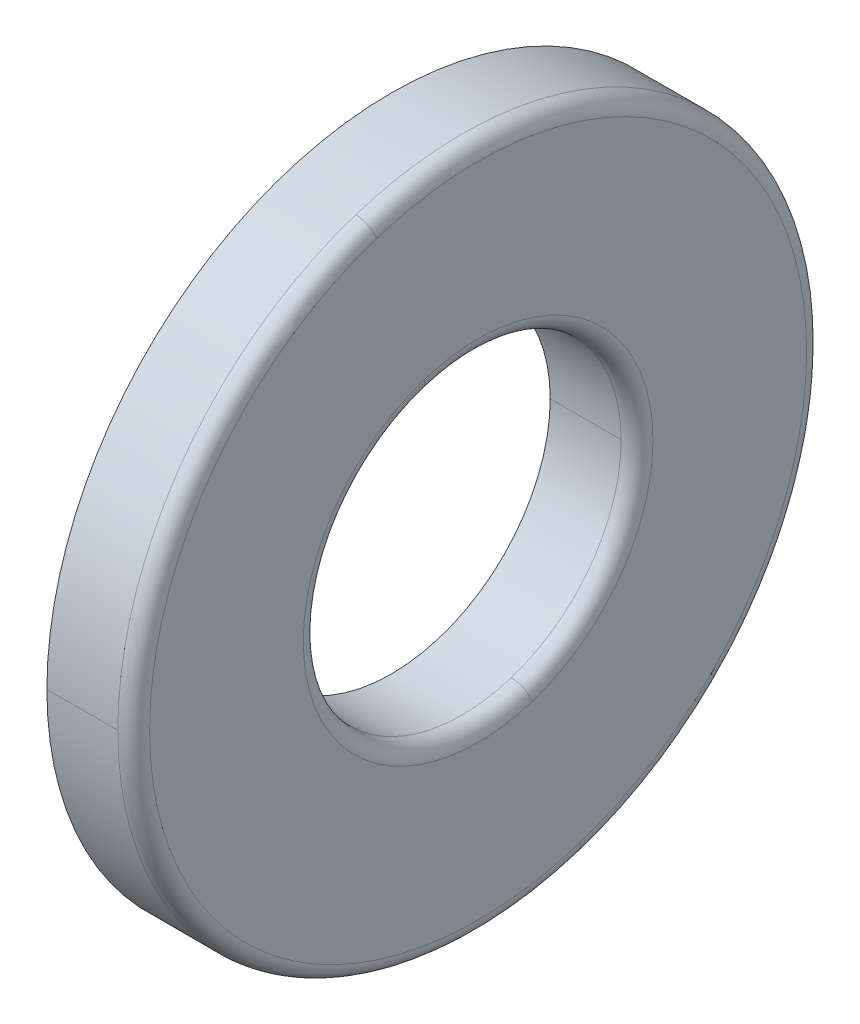
ISO-10303-21;
HEADER;
FILE_DESCRIPTION(('STEP AP214'),'2;1');
FILE_NAME('part.step','',(''),(''),'','','');
FILE_SCHEMA(('AUTOMOTIVE_DESIGN { 1 0 10303 214 1 1 1 1 }'));
ENDSEC;
DATA;
#1=APPLICATION_CONTEXT('core data for automotive mechanical design processes');
#2=APPLICATION_PROTOCOL_DEFINITION('international standard','automotive_design',2000,#1);
#3=PRODUCT_CONTEXT('',#1,'mechanical');
#4=PRODUCT('Part','Part','',(#3));
#5=PRODUCT_RELATED_PRODUCT_CATEGORY('part','',(#4));
#6=PRODUCT_DEFINITION_FORMATION('','',#4);
#7=PRODUCT_DEFINITION_CONTEXT('part definition',#1,'design');
#8=PRODUCT_DEFINITION('design','',#6,#7);
#9=PRODUCT_DEFINITION_SHAPE('','',#8);
#10=(LENGTH_UNIT() NAMED_UNIT(*) SI_UNIT(.MILLI.,.METRE.));
#11=(NAMED_UNIT(*) PLANE_ANGLE_UNIT() SI_UNIT($,.RADIAN.));
#12=(NAMED_UNIT(*) SI_UNIT($,.STERADIAN.) SOLID_ANGLE_UNIT());
#13=UNCERTAINTY_MEASURE_WITH_UNIT(LENGTH_MEASURE(1.E-05),#10,'distance_accuracy_value','');
#14=(GEOMETRIC_REPRESENTATION_CONTEXT(3) GLOBAL_UNCERTAINTY_ASSIGNED_CONTEXT((#13)) GLOBAL_UNIT_ASSIGNED_CONTEXT((#10,
#11,#12)) REPRESENTATION_CONTEXT('',''));
#15=CARTESIAN_POINT('',(0.,0.,0.));
#16=DIRECTION('',(0.,0.,1.));
#17=DIRECTION('',(1.,0.,0.));
#18=AXIS2_PLACEMENT_3D('',#15,#16,#17);
#19=CARTESIAN_POINT('',(5.5,0.,0.));
#20=DIRECTION('',(1.,0.,0.));
#21=DIRECTION('',(0.,-0.309016994374947,0.951056516295154));
#22=AXIS2_PLACEMENT_3D('',#19,#20,#21);
#23=TOROIDAL_SURFACE('',#22,9.,2.778);
#24=CARTESIAN_POINT('',(5.5,-8.55950864665638,-2.78115294937453));
#25=DIRECTION('',(0.,0.309016994374947,-0.951056516295154));
#26=DIRECTION('',(0.8,0.570633909777092,0.185410196624968));
#27=AXIS2_PLACEMENT_3D('',#24,#25,#26);
#28=CIRCLE('',#27,2.778);
#29=CARTESIAN_POINT('',(7.7224,-6.97428764529562,-2.26608342315036));
#30=VERTEX_POINT('',#29);
#31=CARTESIAN_POINT('',(7.7224,-10.1447296480171,-3.29622247559869));
#32=VERTEX_POINT('',#31);
#33=EDGE_CURVE('E11',#30,#32,#28,.T.);
#34=ORIENTED_EDGE('',*,*,#33,.F.);
#35=CARTESIAN_POINT('',(7.7224,0.,0.));
#36=DIRECTION('',(1.,0.,0.));
#37=DIRECTION('',(0.,-0.951056516295154,-0.309016994374947));
#38=AXIS2_PLACEMENT_3D('',#35,#36,#37);
#39=CIRCLE('',#38,7.3332);
#40=CARTESIAN_POINT('',(7.7224,6.97428764529562,2.26608342315036));
#41=VERTEX_POINT('',#40);
#42=EDGE_CURVE('E24',#30,#41,#39,.T.);
#43=ORIENTED_EDGE('',*,*,#42,.T.);
#44=CARTESIAN_POINT('',(5.5,8.55950864665638,2.78115294937453));
#45=DIRECTION('',(0.,-0.309016994374947,0.951056516295154));
#46=DIRECTION('',(0.8,-0.570633909777092,-0.185410196624968));
#47=AXIS2_PLACEMENT_3D('',#44,#45,#46);
#48=CIRCLE('',#47,2.778);
#49=CARTESIAN_POINT('',(7.7224,10.1447296480171,3.29622247559869));
#50=VERTEX_POINT('',#49);
#51=EDGE_CURVE('E326',#41,#50,#48,.T.);
#52=ORIENTED_EDGE('',*,*,#51,.T.);
#53=CARTESIAN_POINT('',(7.7224,0.,0.));
#54=DIRECTION('',(1.,0.,0.));
#55=DIRECTION('',(0.,-0.951056516295154,-0.309016994374947));
#56=AXIS2_PLACEMENT_3D('',#53,#54,#55);
#57=CIRCLE('',#56,10.6668);
#58=EDGE_CURVE('E322',#32,#50,#57,.T.);
#59=ORIENTED_EDGE('',*,*,#58,.F.);
#60=EDGE_LOOP('',(#34,#43,#52,#59));
#61=FACE_BOUND('',#60,.T.);
#62=ADVANCED_FACE('F16',(#61),#23,.F.);
#63=CARTESIAN_POINT('',(7.7224,13.,0.));
#64=DIRECTION('',(-1.,0.,0.));
#65=DIRECTION('',(0.,0.,1.));
#66=AXIS2_PLACEMENT_3D('',#63,#64,#65);
#67=PLANE('',#66);
#68=ORIENTED_EDGE('',*,*,#58,.T.);
#69=CARTESIAN_POINT('',(7.7224,0.,0.));
#70=DIRECTION('',(1.,0.,0.));
#71=DIRECTION('',(0.,0.,-1.));
#72=AXIS2_PLACEMENT_3D('',#69,#70,#71);
#73=CIRCLE('',#72,10.6668);
#74=EDGE_CURVE('E317',#50,#32,#73,.T.);
#75=ORIENTED_EDGE('',*,*,#74,.T.);
#76=EDGE_LOOP('',(#68,#75));
#77=FACE_BOUND('',#76,.T.);
#78=CARTESIAN_POINT('',(7.7224,0.,0.));
#79=DIRECTION('',(1.,0.,0.));
#80=DIRECTION('',(0.,0.,-1.));
#81=AXIS2_PLACEMENT_3D('',#78,#79,#80);
#82=CIRCLE('',#81,13.);
#83=CARTESIAN_POINT('',(7.7224,0.,13.));
#84=VERTEX_POINT('',#83);
#85=CARTESIAN_POINT('',(7.7224,0.,-13.));
#86=VERTEX_POINT('',#85);
#87=EDGE_CURVE('E312',#84,#86,#82,.T.);
#88=ORIENTED_EDGE('',*,*,#87,.F.);
#89=CARTESIAN_POINT('',(7.7224,0.,0.));
#90=DIRECTION('',(1.,0.,0.));
#91=DIRECTION('',(0.,0.,-1.));
#92=AXIS2_PLACEMENT_3D('',#89,#90,#91);
#93=CIRCLE('',#92,13.);
#94=EDGE_CURVE('E307',#86,#84,#93,.T.);
#95=ORIENTED_EDGE('',*,*,#94,.F.);
#96=EDGE_LOOP('',(#88,#95));
#97=FACE_BOUND('',#96,.T.);
#98=ADVANCED_FACE('F232',(#77,#97),#67,.T.);
#99=CARTESIAN_POINT('',(10.4,0.,0.));
#100=DIRECTION('',(1.,0.,0.));
#101=DIRECTION('',(0.,-1.,0.));
#102=AXIS2_PLACEMENT_3D('',#99,#100,#101);
#103=CYLINDRICAL_SURFACE('',#102,13.);
#104=DIRECTION('',(1.,0.,0.));
#105=VECTOR('',#104,1.);
#106=CARTESIAN_POINT('',(7.7224,0.,13.));
#107=LINE('',#106,#105);
#108=CARTESIAN_POINT('',(10.4,0.,13.));
#109=VERTEX_POINT('',#108);
#110=EDGE_CURVE('E303',#84,#109,#107,.T.);
#111=ORIENTED_EDGE('',*,*,#110,.T.);
#112=CARTESIAN_POINT('',(10.4,0.,0.));
#113=DIRECTION('',(1.,0.,0.));
#114=DIRECTION('',(0.,0.,-1.));
#115=AXIS2_PLACEMENT_3D('',#112,#113,#114);
#116=CIRCLE('',#115,13.);
#117=CARTESIAN_POINT('',(10.4,12.363734711837,4.01722092687431));
#118=VERTEX_POINT('',#117);
#119=EDGE_CURVE('E299',#118,#109,#116,.T.);
#120=ORIENTED_EDGE('',*,*,#119,.F.);
#121=CARTESIAN_POINT('',(10.4,0.,0.));
#122=DIRECTION('',(1.,0.,0.));
#123=DIRECTION('',(0.,0.,-1.));
#124=AXIS2_PLACEMENT_3D('',#121,#122,#123);
#125=CIRCLE('',#124,13.);
#126=CARTESIAN_POINT('',(10.4,0.,-13.));
#127=VERTEX_POINT('',#126);
#128=EDGE_CURVE('E295',#127,#118,#125,.T.);
#129=ORIENTED_EDGE('',*,*,#128,.F.);
#130=DIRECTION('',(1.,0.,0.));
#131=VECTOR('',#130,1.);
#132=CARTESIAN_POINT('',(7.7224,0.,-13.));
#133=LINE('',#132,#131);
#134=EDGE_CURVE('E290',#86,#127,#133,.T.);
#135=ORIENTED_EDGE('',*,*,#134,.F.);
#136=ORIENTED_EDGE('',*,*,#94,.T.);
#137=EDGE_LOOP('',(#111,#120,#129,#135,#136));
#138=FACE_BOUND('',#137,.T.);
#139=ADVANCED_FACE('F236',(#138),#103,.T.);
#140=CARTESIAN_POINT('',(10.4,0.,0.));
#141=DIRECTION('',(1.,0.,0.));
#142=DIRECTION('',(0.,1.,0.));
#143=AXIS2_PLACEMENT_3D('',#140,#141,#142);
#144=CYLINDRICAL_SURFACE('',#143,13.);
#145=ORIENTED_EDGE('',*,*,#110,.F.);
#146=ORIENTED_EDGE('',*,*,#87,.T.);
#147=ORIENTED_EDGE('',*,*,#134,.T.);
#148=CARTESIAN_POINT('',(10.4,0.,0.));
#149=DIRECTION('',(1.,0.,0.));
#150=DIRECTION('',(0.,0.,-1.));
#151=AXIS2_PLACEMENT_3D('',#148,#149,#150);
#152=CIRCLE('',#151,13.);
#153=CARTESIAN_POINT('',(10.4,-12.363734711837,-4.01722092687431));
#154=VERTEX_POINT('',#153);
#155=EDGE_CURVE('E286',#154,#127,#152,.T.);
#156=ORIENTED_EDGE('',*,*,#155,.F.);
#157=CARTESIAN_POINT('',(10.4,0.,0.));
#158=DIRECTION('',(1.,0.,0.));
#159=DIRECTION('',(0.,0.,-1.));
#160=AXIS2_PLACEMENT_3D('',#157,#158,#159);
#161=CIRCLE('',#160,13.);
#162=EDGE_CURVE('E265',#109,#154,#161,.T.);
#163=ORIENTED_EDGE('',*,*,#162,.F.);
#164=EDGE_LOOP('',(#145,#146,#147,#156,#163));
#165=FACE_BOUND('',#164,.T.);
#166=ADVANCED_FACE('F241',(#165),#144,.T.);
#167=CARTESIAN_POINT('',(10.4000000000002,0.,0.));
#168=DIRECTION('',(1.,0.,0.));
#169=DIRECTION('',(0.,0.309016994374947,-0.951056516295154));
#170=AXIS2_PLACEMENT_3D('',#167,#168,#169);
#171=TOROIDAL_SURFACE('',#170,12.4000000000002,0.599999999999752);
#172=CARTESIAN_POINT('',(10.4000000000002,-11.7931008020601,-3.83181073024942));
#173=DIRECTION('',(0.,0.309016994374947,-0.951056516295154));
#174=DIRECTION('',(1.,0.,0.));
#175=AXIS2_PLACEMENT_3D('',#172,#173,#174);
#176=CIRCLE('',#175,0.599999999999753);
#177=CARTESIAN_POINT('',(11.,-11.7931008020601,-3.83181073024942));
#178=VERTEX_POINT('',#177);
#179=EDGE_CURVE('E258',#178,#154,#176,.T.);
#180=ORIENTED_EDGE('',*,*,#179,.F.);
#181=CARTESIAN_POINT('',(11.,0.,0.));
#182=DIRECTION('',(1.,0.,0.));
#183=DIRECTION('',(0.,0.,-1.));
#184=AXIS2_PLACEMENT_3D('',#181,#182,#183);
#185=CIRCLE('',#184,12.4);
#186=CARTESIAN_POINT('',(11.,11.7931008020601,3.83181073024942));
#187=VERTEX_POINT('',#186);
#188=EDGE_CURVE('E261',#187,#178,#185,.T.);
#189=ORIENTED_EDGE('',*,*,#188,.F.);
#190=CARTESIAN_POINT('',(10.4000000000002,11.7931008020601,3.83181073024942));
#191=DIRECTION('',(0.,-0.309016994374947,0.951056516295154));
#192=DIRECTION('',(1.,0.,0.));
#193=AXIS2_PLACEMENT_3D('',#190,#191,#192);
#194=CIRCLE('',#193,0.599999999999753);
#195=EDGE_CURVE('E270',#187,#118,#194,.T.);
#196=ORIENTED_EDGE('',*,*,#195,.T.);
#197=ORIENTED_EDGE('',*,*,#119,.T.);
#198=ORIENTED_EDGE('',*,*,#162,.T.);
#199=EDGE_LOOP('',(#180,#189,#196,#197,#198));
#200=FACE_BOUND('',#199,.T.);
#201=ADVANCED_FACE('F248',(#200),#171,.T.);
#202=CARTESIAN_POINT('',(10.4000000000002,0.,0.));
#203=DIRECTION('',(1.,0.,0.));
#204=DIRECTION('',(0.,-0.309016994374947,0.951056516295154));
#205=AXIS2_PLACEMENT_3D('',#202,#203,#204);
#206=TOROIDAL_SURFACE('',#205,12.4000000000002,0.599999999999752);
#207=ORIENTED_EDGE('',*,*,#179,.T.);
#208=ORIENTED_EDGE('',*,*,#155,.T.);
#209=ORIENTED_EDGE('',*,*,#128,.T.);
#210=ORIENTED_EDGE('',*,*,#195,.F.);
#211=CARTESIAN_POINT('',(11.,-11.7931008020599,-3.83181073024935));
#212=CARTESIAN_POINT('',(11.,-11.1911769332214,-5.68424933948481));
#213=CARTESIAN_POINT('',(11.,-10.2256774034156,-7.41861281476744));
#214=CARTESIAN_POINT('',(11.,-8.92688274084615,-8.93922402907802));
#215=CARTESIAN_POINT('',(11.,-5.80307544028565,-11.3891724781346));
#216=CARTESIAN_POINT('',(11.,-1.98489516566409,-12.4763546143959));
#217=CARTESIAN_POINT('',(11.,0.00872708519677936,-12.633259487948));
#218=CARTESIAN_POINT('',(11.,3.94996629031818,-12.1567462241095));
#219=CARTESIAN_POINT('',(11.,7.41858325516425,-10.2256512720727));
#220=CARTESIAN_POINT('',(11.,8.93923116578797,-8.92689080517061));
#221=CARTESIAN_POINT('',(11.,11.3891742692938,-5.80307192493774));
#222=CARTESIAN_POINT('',(11.,12.4763438953675,-1.98489413203545));
#223=CARTESIAN_POINT('',(11.,12.6332980033474,0.00871853059345984));
#224=CARTESIAN_POINT('',(11.,12.3949702581354,1.97935444123545));
#225=CARTESIAN_POINT('',(11.,11.7931008020599,3.83181073024934));
#226=B_SPLINE_CURVE_WITH_KNOTS('',5,(#211,#212,#213,#214,#215,#216,#217,#218,#219,#220,#221,
#222,#223,#224,#225),.UNSPECIFIED.,.F.,.F.,(6,3,3,3,6),(0.,0.785398163397448,1.5707963267949,
2.35619449019234,3.14159265358979),.UNSPECIFIED.);
#227=EDGE_CURVE('E204',#178,#187,#226,.T.);
#228=ORIENTED_EDGE('',*,*,#227,.F.);
#229=EDGE_LOOP('',(#207,#208,#209,#210,#228));
#230=FACE_BOUND('',#229,.T.);
#231=ADVANCED_FACE('F166',(#230),#206,.T.);
#232=CARTESIAN_POINT('',(11.,6.6,0.));
#233=DIRECTION('',(1.,0.,0.));
#234=DIRECTION('',(0.,0.,-1.));
#235=AXIS2_PLACEMENT_3D('',#232,#233,#234);
#236=PLANE('',#235);
#237=ORIENTED_EDGE('',*,*,#227,.T.);
#238=ORIENTED_EDGE('',*,*,#188,.T.);
#239=EDGE_LOOP('',(#237,#238));
#240=FACE_BOUND('',#239,.T.);
#241=CARTESIAN_POINT('',(10.9999999999999,6.27697300754793,2.03951216287464));
#242=CARTESIAN_POINT('',(10.9999999999999,6.24360371278695,2.14221970514661));
#243=CARTESIAN_POINT('',(10.9999999999999,6.20770939606116,2.24410661309418));
#244=CARTESIAN_POINT('',(10.9999999999999,6.13096660407214,2.44599728380728));
#245=CARTESIAN_POINT('',(10.9999999999999,6.0901181288089,2.54600104657281));
#246=CARTESIAN_POINT('',(10.9999999999999,6.00356290513713,2.74388355038861));
#247=CARTESIAN_POINT('',(10.9999999999999,5.9578561567286,2.84176229143889));
#248=CARTESIAN_POINT('',(10.9999999999999,5.86169517413804,3.03515921024924));
#249=CARTESIAN_POINT('',(10.9999999999999,5.81124093995602,3.13067738800932));
#250=CARTESIAN_POINT('',(10.9999999999999,5.70570635340475,3.31912299975042));
#251=CARTESIAN_POINT('',(10.9999999999999,5.65062600103552,3.41205043373144));
#252=CARTESIAN_POINT('',(10.9999999999999,5.53597192002423,3.59509070603002));
#253=CARTESIAN_POINT('',(10.9999999999999,5.47639819138219,3.68520354434757));
#254=CARTESIAN_POINT('',(10.9999999999999,5.35290086315445,3.86239753065683));
#255=CARTESIAN_POINT('',(10.9999999999999,5.28897726356875,3.94947867864854));
#256=CARTESIAN_POINT('',(10.9999999999999,5.15693419448782,4.12039949951736));
#257=CARTESIAN_POINT('',(10.9999999999999,5.08881472499258,4.20423917239447));
#258=CARTESIAN_POINT('',(10.9999999999999,4.94854402092769,4.36847506556386));
#259=CARTESIAN_POINT('',(10.9999999999999,4.87639278635804,4.44887128585613));
#260=CARTESIAN_POINT('',(10.9999999999999,4.72823237103822,4.60602659241432));
#261=CARTESIAN_POINT('',(10.9999999999999,4.65222319028805,4.68278567868025));
#262=CARTESIAN_POINT('',(10.9999999999999,4.49652999531422,4.83248179779818));
#263=CARTESIAN_POINT('',(10.9999999999999,4.41684598109056,4.90541883065017));
#264=CARTESIAN_POINT('',(10.9999999999999,4.25399508495747,5.0472951312464));
#265=CARTESIAN_POINT('',(10.9999999999999,4.17082820304803,5.11623439899062));
#266=CARTESIAN_POINT('',(10.9999999999999,4.00121192784166,5.2499490886351));
#267=CARTESIAN_POINT('',(10.9999999999999,3.91476253454472,5.31472451053536));
#268=CARTESIAN_POINT('',(10.9999999999999,3.73878950072515,5.43995545882738));
#269=CARTESIAN_POINT('',(10.9999999999999,3.64926586020252,5.50041098521915));
#270=CARTESIAN_POINT('',(10.9999999999999,3.46736000222258,5.61685649983571));
#271=CARTESIAN_POINT('',(10.9999999999999,3.37497778476528,5.67284648806049));
#272=CARTESIAN_POINT('',(10.9999999999999,3.18757732976967,5.78022604155735));
#273=CARTESIAN_POINT('',(10.9999999999999,3.09255909223136,5.83161560682942));
#274=CARTESIAN_POINT('',(10.9999999999999,2.90011550433057,5.9296705124569));
#275=CARTESIAN_POINT('',(10.9999999999999,2.80269015396808,5.9763358528123));
#276=CARTESIAN_POINT('',(10.9999999999999,2.60566704662142,6.06482988771413));
#277=CARTESIAN_POINT('',(10.9999999999999,2.50606928963723,6.10665858226056));
#278=CARTESIAN_POINT('',(10.9999999999999,2.30494130876747,6.18537855655551));
#279=CARTESIAN_POINT('',(10.9999999999999,2.2034110848819,6.22226983630403));
#280=CARTESIAN_POINT('',(10.9999999999999,1.99866276541169,6.29102610667896));
#281=CARTESIAN_POINT('',(10.9999999999999,1.89544466982707,6.32289109730537));
#282=CARTESIAN_POINT('',(10.9999999999999,1.68756926839186,6.38151802388262));
#283=CARTESIAN_POINT('',(10.9999999999999,1.58291196254128,6.40827995983346));
#284=CARTESIAN_POINT('',(10.9999999999999,1.37241026919085,6.45663630521178));
#285=CARTESIAN_POINT('',(10.9999999999999,1.26656588169101,6.47823071463927));
#286=CARTESIAN_POINT('',(10.9999999999999,1.05394501344242,6.51619998414714));
#287=CARTESIAN_POINT('',(10.9999999999999,0.947168532693682,6.53257484422753));
#288=CARTESIAN_POINT('',(10.9999999999999,0.732940711841935,6.56006556656898));
#289=CARTESIAN_POINT('',(10.9999999999999,0.625489371738931,6.57118142883006));
#290=CARTESIAN_POINT('',(10.9999999999999,0.410170691868594,6.58812737644707));
#291=CARTESIAN_POINT('',(10.9999999999999,0.302303352101263,6.59395746180302));
#292=CARTESIAN_POINT('',(10.9999999999999,0.0864125347718333,6.6003178104235));
#293=CARTESIAN_POINT('',(10.9999999999999,-0.0216109427902639,6.60084807368804));
#294=CARTESIAN_POINT('',(10.9999999999999,-0.237553797690037,6.59660750067506));
#295=CARTESIAN_POINT('',(10.9999999999999,-0.345473175027714,6.59183666439754));
#296=CARTESIAN_POINT('',(10.9999999999999,-0.560947842246018,6.57700538566291));
#297=CARTESIAN_POINT('',(10.9999999999999,-0.668503132126645,6.5669449432058));
#298=CARTESIAN_POINT('',(10.9999999999999,-0.882990514316799,6.54155868859907));
#299=CARTESIAN_POINT('',(10.9999999999999,-0.989922606626325,6.52623287644944));
#300=CARTESIAN_POINT('',(10.9999999999999,-1.20290598489776,6.49035280368152));
#301=CARTESIAN_POINT('',(10.9999999999999,-1.30895727085966,6.46979854306322));
#302=CARTESIAN_POINT('',(10.9999999999999,-1.51992354959898,6.42351109037214));
#303=CARTESIAN_POINT('',(10.9999999999999,-1.62483854237639,6.39777789829934));
#304=CARTESIAN_POINT('',(10.9999999999999,-1.83327948533964,6.34119457621293));
#305=CARTESIAN_POINT('',(10.9999999999999,-1.93680543552547,6.3103444461993));
#306=CARTESIAN_POINT('',(10.9999999999999,-2.14221889022379,6.24360156889657));
#307=CARTESIAN_POINT('',(10.9999999999999,-2.24410639473626,6.20770882160747));
#308=CARTESIAN_POINT('',(10.9999999999999,-2.44599750216518,6.13096717852584));
#309=CARTESIAN_POINT('',(10.9999999999999,-2.54600110508162,6.09011828273331));
#310=CARTESIAN_POINT('',(10.9999999999999,-2.74388349187978,6.00356275121274));
#311=CARTESIAN_POINT('',(10.9999999999999,-2.84176227576149,5.95785611548469));
#312=CARTESIAN_POINT('',(10.9999999999999,-3.03515922592663,5.86169521538197));
#313=CARTESIAN_POINT('',(10.9999999999999,-3.13067739221006,5.8112409510073));
#314=CARTESIAN_POINT('',(10.9999999999999,-3.31912299554967,5.70570634235348));
#315=CARTESIAN_POINT('',(10.9999999999999,-3.41205043260584,5.65062599807434));
#316=CARTESIAN_POINT('',(10.9999999999999,-3.59509070715559,5.53597192298542));
#317=CARTESIAN_POINT('',(10.9999999999999,-3.68520354464916,5.47639819217564));
#318=CARTESIAN_POINT('',(10.9999999999999,-3.86239753035523,5.35290086236101));
#319=CARTESIAN_POINT('',(10.9999999999999,-3.94947867856772,5.28897726335616));
#320=CARTESIAN_POINT('',(10.9999999999999,-4.12039949959817,5.15693419470043));
#321=CARTESIAN_POINT('',(10.9999999999999,-4.20423917241612,5.08881472504956));
#322=CARTESIAN_POINT('',(10.9999999999999,-4.3684750655422,4.94854402087073));
#323=CARTESIAN_POINT('',(10.9999999999999,-4.44887128585032,4.87639278634278));
#324=CARTESIAN_POINT('',(10.9999999999999,-4.60602659242012,4.72823237105349));
#325=CARTESIAN_POINT('',(10.9999999999999,-4.6827856786818,4.65222319029214));
#326=CARTESIAN_POINT('',(10.9999999999999,-4.83248179779661,4.49652999531014));
#327=CARTESIAN_POINT('',(10.9999999999999,-4.90541883064975,4.41684598108947));
#328=CARTESIAN_POINT('',(10.9999999999999,-5.0472951312468,4.25399508495857));
#329=CARTESIAN_POINT('',(10.9999999999999,-5.11623439899072,4.17082820304834));
#330=CARTESIAN_POINT('',(10.9999999999999,-5.24994908863498,4.00121192784138));
#331=CARTESIAN_POINT('',(10.9999999999999,-5.31472451053532,3.91476253454465));
#332=CARTESIAN_POINT('',(10.9999999999999,-5.43995545882741,3.73878950072524));
#333=CARTESIAN_POINT('',(10.9999999999999,-5.50041098521915,3.64926586020255));
#334=CARTESIAN_POINT('',(10.9999999999999,-5.61685649983569,3.46736000222257));
#335=CARTESIAN_POINT('',(10.9999999999999,-5.67284648806049,3.37497778476528));
#336=CARTESIAN_POINT('',(10.9999999999999,-5.78022604155735,3.18757732976968));
#337=CARTESIAN_POINT('',(10.9999999999999,-5.83161560682942,3.09255909223137));
#338=CARTESIAN_POINT('',(10.9999999999999,-5.92967051245689,2.90011550433058));
#339=CARTESIAN_POINT('',(10.9999999999999,-5.97633585281229,2.80269015396809));
#340=CARTESIAN_POINT('',(10.9999999999999,-6.06482988771413,2.60566704662142));
#341=CARTESIAN_POINT('',(10.9999999999999,-6.10665858226058,2.50606928963724));
#342=CARTESIAN_POINT('',(10.9999999999999,-6.18537855655548,2.30494130876749));
#343=CARTESIAN_POINT('',(10.9999999999999,-6.22226983630394,2.20341108488193));
#344=CARTESIAN_POINT('',(10.9999999999999,-6.29102610667904,1.99866276541168));
#345=CARTESIAN_POINT('',(10.9999999999999,-6.32289109730567,1.89544466982699));
#346=CARTESIAN_POINT('',(10.9999999999999,-6.38151802388232,1.68756926839195));
#347=CARTESIAN_POINT('',(10.9999999999999,-6.40827995983232,1.58291196254159));
#348=CARTESIAN_POINT('',(10.9999999999999,-6.45663630521291,1.37241026919055));
#349=CARTESIAN_POINT('',(10.9999999999999,-6.47823071464349,1.26656588168987));
#350=CARTESIAN_POINT('',(10.9999999999999,-6.51619998414292,1.05394501344358));
#351=CARTESIAN_POINT('',(10.9999999999999,-6.53257484421176,0.947168532697971));
#352=CARTESIAN_POINT('',(10.9999999999999,-6.56006556658474,0.732940711837669));
#353=CARTESIAN_POINT('',(10.9999999999999,-6.57118142888887,0.625489371722977));
#354=CARTESIAN_POINT('',(10.9999999999999,-6.58812737638826,0.410170691884573));
#355=CARTESIAN_POINT('',(10.9999999999999,-6.59395746158352,0.30230335216086));
#356=CARTESIAN_POINT('',(10.9999999999999,-6.600317810643,0.0864125347122596));
#357=CARTESIAN_POINT('',(10.9999999999999,-6.60084807450723,-0.0216109430126283));
#358=CARTESIAN_POINT('',(10.9999999999999,-6.59660749985587,-0.237553797467649));
#359=CARTESIAN_POINT('',(10.9999999999999,-6.59183666134029,-0.345473174197782));
#360=CARTESIAN_POINT('',(10.9999999999999,-6.57700538872016,-0.560947843075927));
#361=CARTESIAN_POINT('',(10.9999999999999,-6.56694495461561,-0.66850313522394));
#362=CARTESIAN_POINT('',(10.9999999999999,-6.54155867718926,-0.882990511219491));
#363=CARTESIAN_POINT('',(10.9999999999999,-6.52623283386747,-0.989922595067029));
#364=CARTESIAN_POINT('',(10.9999999999999,-6.49035284626349,-1.20290599645704));
#365=CARTESIAN_POINT('',(10.9999999999999,-6.46979870198131,-1.30895731399952));
#366=CARTESIAN_POINT('',(10.9999999999999,-6.42351093145405,-1.51992350645911));
#367=CARTESIAN_POINT('',(10.9999999999999,-6.39777730520898,-1.62483838137623));
#368=CARTESIAN_POINT('',(10.9999999999999,-6.34119516930329,-1.83327964633977));
#369=CARTESIAN_POINT('',(10.9999999999999,-6.31034665964267,-1.9368060363862));
#370=CARTESIAN_POINT('',(10.9999999999999,-6.27697300754794,-2.03951216287462));
#371=B_SPLINE_CURVE_WITH_KNOTS('',3,(#241,#242,#243,#244,#245,#246,#247,#248,#249,#250,#251,
#252,#253,#254,#255,#256,#257,#258,#259,#260,#261,#262,#263,#264,#265,#266,#267,#268,#269,#270,
#271,#272,#273,#274,#275,#276,#277,#278,#279,#280,#281,#282,#283,#284,#285,#286,#287,#288,#289,
#290,#291,#292,#293,#294,#295,#296,#297,#298,#299,#300,#301,#302,#303,#304,#305,#306,#307,#308,
#309,#310,#311,#312,#313,#314,#315,#316,#317,#318,#319,#320,#321,#322,#323,#324,#325,#326,#327,
#328,#329,#330,#331,#332,#333,#334,#335,#336,#337,#338,#339,#340,#341,#342,#343,#344,#345,#346,
#347,#348,#349,#350,#351,#352,#353,#354,#355,#356,#357,#358,#359,#360,#361,#362,#363,#364,#365,
#366,#367,#368,#369,#370),.UNSPECIFIED.,.F.,.F.,(4,2,2,2,2,2,2,2,2,2,2,2,2,2,2,2,2,2,2,2,2,2,2,
2,2,2,2,2,2,2,2,2,2,2,2,2,2,2,2,2,2,2,2,2,2,2,2,2,2,2,2,2,2,2,2,2,2,2,2,2,2,2,2,2,4),(0.,
0.323944216502437,0.647888433004875,0.971832649507313,1.29577686600975,1.61972108251219,
1.94366529901463,2.26760951551706,2.5915537320195,2.91549794852194,3.23944216502438,
3.56338638152682,3.88733059802926,4.21127481453169,4.53521903103413,4.85916324753657,
5.18310746403901,5.50705168054144,5.83099589704388,6.15494011354632,6.47888433004876,
6.8028285465512,7.12677276305364,7.45071697955608,7.77466119605851,8.09860541256095,
8.42254962906339,8.74649384556582,9.07043806206826,9.3943822785707,9.71832649507314,
10.0422707115756,10.366214928078,10.6901591445805,11.0141033610829,11.3380475775853,
11.6619917940878,11.9859360105902,12.3098802270926,12.6338244435951,12.9577686600975,
13.2817128766,13.6056570931024,13.9296013096048,14.2535455261073,14.5774897426097,
14.9014339591121,15.2253781756146,15.549322392117,15.8732666086195,16.1972108251219,
16.5211550416243,16.8450992581268,17.1690434746292,17.4929876911317,17.8169319076341,
18.1408761241365,18.464820340639,18.7887645571414,19.1127087736438,19.4366529901463,
19.7605972066487,20.0845414231512,20.4084856396536,20.732429856156),.UNSPECIFIED.);
#372=CARTESIAN_POINT('',(10.9999999999999,6.27697300754794,2.03951216287463));
#373=VERTEX_POINT('',#372);
#374=CARTESIAN_POINT('',(10.9999999999999,-6.27697300754794,-2.03951216287463));
#375=VERTEX_POINT('',#374);
#376=EDGE_CURVE('E200',#373,#375,#371,.T.);
#377=ORIENTED_EDGE('',*,*,#376,.F.);
#378=CARTESIAN_POINT('',(10.9999999999999,-6.27697300754793,-2.03951216287464));
#379=CARTESIAN_POINT('',(10.9999999999999,-6.24360371278695,-2.14221970514661));
#380=CARTESIAN_POINT('',(10.9999999999999,-6.20770939606116,-2.24410661309418));
#381=CARTESIAN_POINT('',(10.9999999999999,-6.13096660407214,-2.44599728380728));
#382=CARTESIAN_POINT('',(10.9999999999999,-6.0901181288089,-2.54600104657281));
#383=CARTESIAN_POINT('',(10.9999999999999,-6.00356290513713,-2.74388355038861));
#384=CARTESIAN_POINT('',(10.9999999999999,-5.9578561567286,-2.84176229143888));
#385=CARTESIAN_POINT('',(10.9999999999999,-5.86169517413804,-3.03515921024924));
#386=CARTESIAN_POINT('',(10.9999999999999,-5.81124093995602,-3.13067738800932));
#387=CARTESIAN_POINT('',(10.9999999999999,-5.70570635340475,-3.31912299975042));
#388=CARTESIAN_POINT('',(10.9999999999999,-5.65062600103552,-3.41205043373144));
#389=CARTESIAN_POINT('',(10.9999999999999,-5.53597192002423,-3.59509070603001));
#390=CARTESIAN_POINT('',(10.9999999999999,-5.47639819138219,-3.68520354434757));
#391=CARTESIAN_POINT('',(10.9999999999999,-5.35290086315445,-3.86239753065683));
#392=CARTESIAN_POINT('',(10.9999999999999,-5.28897726356876,-3.94947867864854));
#393=CARTESIAN_POINT('',(10.9999999999999,-5.15693419448782,-4.12039949951736));
#394=CARTESIAN_POINT('',(10.9999999999999,-5.08881472499258,-4.20423917239447));
#395=CARTESIAN_POINT('',(10.9999999999999,-4.94854402092769,-4.36847506556386));
#396=CARTESIAN_POINT('',(10.9999999999999,-4.87639278635804,-4.44887128585612));
#397=CARTESIAN_POINT('',(10.9999999999999,-4.72823237103822,-4.60602659241432));
#398=CARTESIAN_POINT('',(10.9999999999999,-4.65222319028805,-4.68278567868025));
#399=CARTESIAN_POINT('',(10.9999999999999,-4.49652999531422,-4.83248179779817));
#400=CARTESIAN_POINT('',(10.9999999999999,-4.41684598109056,-4.90541883065017));
#401=CARTESIAN_POINT('',(10.9999999999999,-4.25399508495747,-5.04729513124639));
#402=CARTESIAN_POINT('',(10.9999999999999,-4.17082820304804,-5.11623439899062));
#403=CARTESIAN_POINT('',(10.9999999999999,-4.00121192784166,-5.2499490886351));
#404=CARTESIAN_POINT('',(10.9999999999999,-3.91476253454473,-5.31472451053536));
#405=CARTESIAN_POINT('',(10.9999999999999,-3.73878950072516,-5.43995545882738));
#406=CARTESIAN_POINT('',(10.9999999999999,-3.64926586020252,-5.50041098521915));
#407=CARTESIAN_POINT('',(10.9999999999999,-3.46736000222259,-5.6168564998357));
#408=CARTESIAN_POINT('',(10.9999999999999,-3.37497778476528,-5.67284648806049));
#409=CARTESIAN_POINT('',(10.9999999999999,-3.18757732976967,-5.78022604155735));
#410=CARTESIAN_POINT('',(10.9999999999999,-3.09255909223136,-5.83161560682942));
#411=CARTESIAN_POINT('',(10.9999999999999,-2.90011550433057,-5.9296705124569));
#412=CARTESIAN_POINT('',(10.9999999999999,-2.80269015396809,-5.9763358528123));
#413=CARTESIAN_POINT('',(10.9999999999999,-2.60566704662142,-6.06482988771413));
#414=CARTESIAN_POINT('',(10.9999999999999,-2.50606928963724,-6.10665858226055));
#415=CARTESIAN_POINT('',(10.9999999999999,-2.30494130876748,-6.1853785565555));
#416=CARTESIAN_POINT('',(10.9999999999999,-2.2034110848819,-6.22226983630403));
#417=CARTESIAN_POINT('',(10.9999999999999,-1.9986627654117,-6.29102610667896));
#418=CARTESIAN_POINT('',(10.9999999999999,-1.89544466982707,-6.32289109730537));
#419=CARTESIAN_POINT('',(10.9999999999999,-1.68756926839186,-6.38151802388262));
#420=CARTESIAN_POINT('',(10.9999999999999,-1.58291196254128,-6.40827995983345));
#421=CARTESIAN_POINT('',(10.9999999999999,-1.37241026919086,-6.45663630521178));
#422=CARTESIAN_POINT('',(10.9999999999999,-1.26656588169102,-6.47823071463927));
#423=CARTESIAN_POINT('',(10.9999999999999,-1.05394501344244,-6.51619998414714));
#424=CARTESIAN_POINT('',(10.9999999999999,-0.947168532693694,-6.53257484422752));
#425=CARTESIAN_POINT('',(10.9999999999999,-0.732940711841946,-6.56006556656898));
#426=CARTESIAN_POINT('',(10.9999999999999,-0.625489371738941,-6.57118142883005));
#427=CARTESIAN_POINT('',(10.9999999999999,-0.410170691868603,-6.58812737644708));
#428=CARTESIAN_POINT('',(10.9999999999999,-0.30230335210127,-6.59395746180302));
#429=CARTESIAN_POINT('',(10.9999999999999,-0.0864125347718405,-6.6003178104235));
#430=CARTESIAN_POINT('',(10.9999999999999,0.0216109427902557,-6.60084807368804));
#431=CARTESIAN_POINT('',(10.9999999999999,0.237553797690029,-6.59660750067506));
#432=CARTESIAN_POINT('',(10.9999999999999,0.345473175027706,-6.59183666439754));
#433=CARTESIAN_POINT('',(10.9999999999999,0.56094784224601,-6.57700538566291));
#434=CARTESIAN_POINT('',(10.9999999999999,0.668503132126637,-6.5669449432058));
#435=CARTESIAN_POINT('',(10.9999999999999,0.88299051431679,-6.54155868859907));
#436=CARTESIAN_POINT('',(10.9999999999999,0.989922606626316,-6.52623287644944));
#437=CARTESIAN_POINT('',(10.9999999999999,1.20290598489775,-6.49035280368152));
#438=CARTESIAN_POINT('',(10.9999999999999,1.30895727085965,-6.46979854306322));
#439=CARTESIAN_POINT('',(10.9999999999999,1.51992354959897,-6.42351109037214));
#440=CARTESIAN_POINT('',(10.9999999999999,1.62483854237638,-6.39777789829935));
#441=CARTESIAN_POINT('',(10.9999999999999,1.83327948533962,-6.34119457621293));
#442=CARTESIAN_POINT('',(10.9999999999999,1.93680543552546,-6.3103444461993));
#443=CARTESIAN_POINT('',(10.9999999999999,2.14221889022378,-6.24360156889658));
#444=CARTESIAN_POINT('',(10.9999999999999,2.24410639473625,-6.20770882160747));
#445=CARTESIAN_POINT('',(10.9999999999999,2.44599750216517,-6.13096717852584));
#446=CARTESIAN_POINT('',(10.9999999999999,2.54600110508161,-6.09011828273331));
#447=CARTESIAN_POINT('',(10.9999999999999,2.74388349187977,-6.00356275121274));
#448=CARTESIAN_POINT('',(10.9999999999999,2.84176227576148,-5.95785611548469));
#449=CARTESIAN_POINT('',(10.9999999999999,3.03515922592662,-5.86169521538197));
#450=CARTESIAN_POINT('',(10.9999999999999,3.13067739221005,-5.8112409510073));
#451=CARTESIAN_POINT('',(10.9999999999999,3.31912299554966,-5.70570634235349));
#452=CARTESIAN_POINT('',(10.9999999999999,3.41205043260584,-5.65062599807435));
#453=CARTESIAN_POINT('',(10.9999999999999,3.59509070715559,-5.53597192298542));
#454=CARTESIAN_POINT('',(10.9999999999999,3.68520354464916,-5.47639819217564));
#455=CARTESIAN_POINT('',(10.9999999999999,3.86239753035522,-5.35290086236101));
#456=CARTESIAN_POINT('',(10.9999999999999,3.94947867856771,-5.28897726335616));
#457=CARTESIAN_POINT('',(10.9999999999999,4.12039949959816,-5.15693419470044));
#458=CARTESIAN_POINT('',(10.9999999999999,4.20423917241611,-5.08881472504956));
#459=CARTESIAN_POINT('',(10.9999999999999,4.36847506554219,-4.94854402087074));
#460=CARTESIAN_POINT('',(10.9999999999999,4.44887128585031,-4.87639278634279));
#461=CARTESIAN_POINT('',(10.9999999999999,4.60602659242011,-4.7282323710535));
#462=CARTESIAN_POINT('',(10.9999999999999,4.68278567868179,-4.65222319029215));
#463=CARTESIAN_POINT('',(10.9999999999999,4.8324817977966,-4.49652999531015));
#464=CARTESIAN_POINT('',(10.9999999999999,4.90541883064974,-4.41684598108948));
#465=CARTESIAN_POINT('',(10.9999999999999,5.0472951312468,-4.25399508495858));
#466=CARTESIAN_POINT('',(10.9999999999999,5.11623439899072,-4.17082820304835));
#467=CARTESIAN_POINT('',(10.9999999999999,5.24994908863497,-4.00121192784139));
#468=CARTESIAN_POINT('',(10.9999999999999,5.31472451053531,-3.91476253454466));
#469=CARTESIAN_POINT('',(10.9999999999999,5.4399554588274,-3.73878950072525));
#470=CARTESIAN_POINT('',(10.9999999999999,5.50041098521914,-3.64926586020256));
#471=CARTESIAN_POINT('',(10.9999999999999,5.61685649983569,-3.46736000222258));
#472=CARTESIAN_POINT('',(10.9999999999999,5.67284648806048,-3.3749777847653));
#473=CARTESIAN_POINT('',(10.9999999999999,5.78022604155734,-3.1875773297697));
#474=CARTESIAN_POINT('',(10.9999999999999,5.83161560682941,-3.09255909223138));
#475=CARTESIAN_POINT('',(10.9999999999999,5.92967051245688,-2.90011550433059));
#476=CARTESIAN_POINT('',(10.9999999999999,5.97633585281229,-2.80269015396811));
#477=CARTESIAN_POINT('',(10.9999999999999,6.06482988771413,-2.60566704662144));
#478=CARTESIAN_POINT('',(10.9999999999999,6.10665858226057,-2.50606928963725));
#479=CARTESIAN_POINT('',(10.9999999999999,6.18537855655548,-2.3049413087675));
#480=CARTESIAN_POINT('',(10.9999999999999,6.22226983630394,-2.20341108488194));
#481=CARTESIAN_POINT('',(10.9999999999999,6.29102610667904,-1.9986627654117));
#482=CARTESIAN_POINT('',(10.9999999999999,6.32289109730567,-1.89544466982701));
#483=CARTESIAN_POINT('',(10.9999999999999,6.38151802388231,-1.68756926839196));
#484=CARTESIAN_POINT('',(10.9999999999999,6.40827995983232,-1.58291196254161));
#485=CARTESIAN_POINT('',(10.9999999999999,6.45663630521291,-1.37241026919057));
#486=CARTESIAN_POINT('',(10.9999999999999,6.47823071464349,-1.26656588168989));
#487=CARTESIAN_POINT('',(10.9999999999999,6.51619998414292,-1.0539450134436));
#488=CARTESIAN_POINT('',(10.9999999999999,6.53257484421176,-0.94716853269799));
#489=CARTESIAN_POINT('',(10.9999999999999,6.56006556658474,-0.732940711837687));
#490=CARTESIAN_POINT('',(10.9999999999999,6.57118142888887,-0.625489371722995));
#491=CARTESIAN_POINT('',(10.9999999999999,6.58812737638826,-0.410170691884591));
#492=CARTESIAN_POINT('',(10.9999999999999,6.59395746158352,-0.302303352160878));
#493=CARTESIAN_POINT('',(10.9999999999999,6.600317810643,-0.086412534712278));
#494=CARTESIAN_POINT('',(10.9999999999999,6.60084807450723,0.0216109430126099));
#495=CARTESIAN_POINT('',(10.9999999999999,6.59660749985587,0.237553797467631));
#496=CARTESIAN_POINT('',(10.9999999999999,6.59183666134029,0.345473174197764));
#497=CARTESIAN_POINT('',(10.9999999999999,6.57700538872016,0.560947843075909));
#498=CARTESIAN_POINT('',(10.9999999999999,6.56694495461561,0.668503135223922));
#499=CARTESIAN_POINT('',(10.9999999999999,6.54155867718926,0.882990511219472));
#500=CARTESIAN_POINT('',(10.9999999999999,6.52623283386747,0.98992259506701));
#501=CARTESIAN_POINT('',(10.9999999999999,6.49035284626349,1.20290599645702));
#502=CARTESIAN_POINT('',(10.9999999999999,6.46979870198131,1.3089573139995));
#503=CARTESIAN_POINT('',(10.9999999999999,6.42351093145406,1.51992350645909));
#504=CARTESIAN_POINT('',(10.9999999999999,6.39777730520899,1.62483838137621));
#505=CARTESIAN_POINT('',(10.9999999999999,6.3411951693033,1.83327964633976));
#506=CARTESIAN_POINT('',(10.9999999999999,6.31034665964267,1.93680603638619));
#507=CARTESIAN_POINT('',(10.9999999999999,6.27697300754795,2.0395121628746));
#508=B_SPLINE_CURVE_WITH_KNOTS('',3,(#378,#379,#380,#381,#382,#383,#384,#385,#386,#387,#388,
#389,#390,#391,#392,#393,#394,#395,#396,#397,#398,#399,#400,#401,#402,#403,#404,#405,#406,#407,
#408,#409,#410,#411,#412,#413,#414,#415,#416,#417,#418,#419,#420,#421,#422,#423,#424,#425,#426,
#427,#428,#429,#430,#431,#432,#433,#434,#435,#436,#437,#438,#439,#440,#441,#442,#443,#444,#445,
#446,#447,#448,#449,#450,#451,#452,#453,#454,#455,#456,#457,#458,#459,#460,#461,#462,#463,#464,
#465,#466,#467,#468,#469,#470,#471,#472,#473,#474,#475,#476,#477,#478,#479,#480,#481,#482,#483,
#484,#485,#486,#487,#488,#489,#490,#491,#492,#493,#494,#495,#496,#497,#498,#499,#500,#501,#502,
#503,#504,#505,#506,#507),.UNSPECIFIED.,.F.,.F.,(4,2,2,2,2,2,2,2,2,2,2,2,2,2,2,2,2,2,2,2,2,2,2,
2,2,2,2,2,2,2,2,2,2,2,2,2,2,2,2,2,2,2,2,2,2,2,2,2,2,2,2,2,2,2,2,2,2,2,2,2,2,2,2,2,4),(0.,
0.323944216502437,0.647888433004875,0.971832649507313,1.29577686600975,1.61972108251219,
1.94366529901462,2.26760951551706,2.5915537320195,2.91549794852194,3.23944216502437,
3.56338638152681,3.88733059802925,4.21127481453169,4.53521903103413,4.85916324753656,
5.183107464039,5.50705168054144,5.83099589704388,6.15494011354632,6.47888433004875,
6.80282854655119,7.12677276305363,7.45071697955606,7.7746611960585,8.09860541256095,
8.42254962906338,8.74649384556582,9.07043806206825,9.39438227857069,9.71832649507313,
10.0422707115756,10.366214928078,10.6901591445804,11.0141033610829,11.3380475775853,
11.6619917940878,11.9859360105902,12.3098802270926,12.6338244435951,12.9577686600975,
13.2817128765999,13.6056570931024,13.9296013096048,14.2535455261073,14.5774897426097,
14.9014339591121,15.2253781756146,15.549322392117,15.8732666086195,16.1972108251219,
16.5211550416243,16.8450992581268,17.1690434746292,17.4929876911316,17.8169319076341,
18.1408761241365,18.4648203406389,18.7887645571414,19.1127087736438,19.4366529901463,
19.7605972066487,20.0845414231511,20.4084856396536,20.732429856156),.UNSPECIFIED.);
#509=EDGE_CURVE('E190',#375,#373,#508,.T.);
#510=ORIENTED_EDGE('',*,*,#509,.F.);
#511=EDGE_LOOP('',(#377,#510));
#512=FACE_BOUND('',#511,.T.);
#513=ADVANCED_FACE('F160',(#240,#512),#236,.T.);
#514=CARTESIAN_POINT('',(10.4,0.,0.));
#515=DIRECTION('',(1.,0.,0.));
#516=DIRECTION('',(0.,-0.309016994374947,0.951056516295154));
#517=AXIS2_PLACEMENT_3D('',#514,#515,#516);
#518=TOROIDAL_SURFACE('',#517,6.59999999999992,0.599999999999924);
#519=CARTESIAN_POINT('',(10.4,-6.27697300754794,-2.03951216287463));
#520=DIRECTION('',(0.,0.309016994374947,-0.951056516295154));
#521=DIRECTION('',(0.,0.951056516295154,0.309016994374947));
#522=AXIS2_PLACEMENT_3D('',#519,#520,#521);
#523=CIRCLE('',#522,0.599999999999924);
#524=CARTESIAN_POINT('',(10.4,-5.70633909777092,-1.85410196624968));
#525=VERTEX_POINT('',#524);
#526=EDGE_CURVE('E141',#525,#375,#523,.T.);
#527=ORIENTED_EDGE('',*,*,#526,.T.);
#528=ORIENTED_EDGE('',*,*,#509,.T.);
#529=CARTESIAN_POINT('',(10.4,6.27697300754794,2.03951216287463));
#530=DIRECTION('',(0.,-0.309016994374947,0.951056516295154));
#531=DIRECTION('',(0.,-0.951056516295154,-0.309016994374947));
#532=AXIS2_PLACEMENT_3D('',#529,#530,#531);
#533=CIRCLE('',#532,0.599999999999924);
#534=CARTESIAN_POINT('',(10.4,5.70633909777092,1.85410196624968));
#535=VERTEX_POINT('',#534);
#536=EDGE_CURVE('E136',#535,#373,#533,.T.);
#537=ORIENTED_EDGE('',*,*,#536,.F.);
#538=CARTESIAN_POINT('',(10.4,0.,0.));
#539=DIRECTION('',(1.,0.,0.));
#540=DIRECTION('',(0.,0.,-1.));
#541=AXIS2_PLACEMENT_3D('',#538,#539,#540);
#542=CIRCLE('',#541,6.);
#543=CARTESIAN_POINT('',(10.4,0.,-6.));
#544=VERTEX_POINT('',#543);
#545=EDGE_CURVE('E132',#544,#535,#542,.T.);
#546=ORIENTED_EDGE('',*,*,#545,.F.);
#547=CARTESIAN_POINT('',(10.4,0.,0.));
#548=DIRECTION('',(1.,0.,0.));
#549=DIRECTION('',(0.,0.,-1.));
#550=AXIS2_PLACEMENT_3D('',#547,#548,#549);
#551=CIRCLE('',#550,6.);
#552=EDGE_CURVE('E108',#525,#544,#551,.T.);
#553=ORIENTED_EDGE('',*,*,#552,.F.);
#554=EDGE_LOOP('',(#527,#528,#537,#546,#553));
#555=FACE_BOUND('',#554,.T.);
#556=ADVANCED_FACE('F150',(#555),#518,.T.);
#557=CARTESIAN_POINT('',(10.4,0.,0.));
#558=DIRECTION('',(1.,0.,0.));
#559=DIRECTION('',(0.,1.,0.));
#560=AXIS2_PLACEMENT_3D('',#557,#558,#559);
#561=CYLINDRICAL_SURFACE('',#560,6.);
#562=DIRECTION('',(1.,0.,0.));
#563=VECTOR('',#562,1.);
#564=CARTESIAN_POINT('',(7.7224,0.,6.));
#565=LINE('',#564,#563);
#566=CARTESIAN_POINT('',(7.7224,0.,6.));
#567=VERTEX_POINT('',#566);
#568=CARTESIAN_POINT('',(10.4,0.,6.));
#569=VERTEX_POINT('',#568);
#570=EDGE_CURVE('E92',#567,#569,#565,.T.);
#571=ORIENTED_EDGE('',*,*,#570,.T.);
#572=CARTESIAN_POINT('',(10.4,0.,0.));
#573=DIRECTION('',(1.,0.,0.));
#574=DIRECTION('',(0.,0.,-1.));
#575=AXIS2_PLACEMENT_3D('',#572,#573,#574);
#576=CIRCLE('',#575,6.);
#577=EDGE_CURVE('E109',#569,#525,#576,.T.);
#578=ORIENTED_EDGE('',*,*,#577,.T.);
#579=ORIENTED_EDGE('',*,*,#552,.T.);
#580=DIRECTION('',(1.,0.,0.));
#581=VECTOR('',#580,1.);
#582=CARTESIAN_POINT('',(7.7224,0.,-6.));
#583=LINE('',#582,#581);
#584=CARTESIAN_POINT('',(7.7224,0.,-6.));
#585=VERTEX_POINT('',#584);
#586=EDGE_CURVE('E96',#585,#544,#583,.T.);
#587=ORIENTED_EDGE('',*,*,#586,.F.);
#588=CARTESIAN_POINT('',(7.7224,0.,0.));
#589=DIRECTION('',(1.,0.,0.));
#590=DIRECTION('',(0.,0.,-1.));
#591=AXIS2_PLACEMENT_3D('',#588,#589,#590);
#592=CIRCLE('',#591,6.);
#593=EDGE_CURVE('E88',#567,#585,#592,.T.);
#594=ORIENTED_EDGE('',*,*,#593,.F.);
#595=EDGE_LOOP('',(#571,#578,#579,#587,#594));
#596=FACE_BOUND('',#595,.T.);
#597=ADVANCED_FACE('F90',(#596),#561,.F.);
#598=CARTESIAN_POINT('',(7.7224,7.3332,0.));
#599=DIRECTION('',(-1.,0.,0.));
#600=DIRECTION('',(0.,0.,1.));
#601=AXIS2_PLACEMENT_3D('',#598,#599,#600);
#602=PLANE('',#601);
#603=CARTESIAN_POINT('',(7.7224,0.,0.));
#604=DIRECTION('',(1.,0.,0.));
#605=DIRECTION('',(0.,0.,-1.));
#606=AXIS2_PLACEMENT_3D('',#603,#604,#605);
#607=CIRCLE('',#606,6.);
#608=EDGE_CURVE('E100',#585,#567,#607,.T.);
#609=ORIENTED_EDGE('',*,*,#608,.T.);
#610=ORIENTED_EDGE('',*,*,#593,.T.);
#611=EDGE_LOOP('',(#609,#610));
#612=FACE_BOUND('',#611,.T.);
#613=ORIENTED_EDGE('',*,*,#42,.F.);
#614=CARTESIAN_POINT('',(7.7224,0.,0.));
#615=DIRECTION('',(1.,0.,0.));
#616=DIRECTION('',(0.,0.,-1.));
#617=AXIS2_PLACEMENT_3D('',#614,#615,#616);
#618=CIRCLE('',#617,7.3332);
#619=EDGE_CURVE('E113',#41,#30,#618,.T.);
#620=ORIENTED_EDGE('',*,*,#619,.F.);
#621=EDGE_LOOP('',(#613,#620));
#622=FACE_BOUND('',#621,.T.);
#623=ADVANCED_FACE('F111',(#612,#622),#602,.T.);
#624=CARTESIAN_POINT('',(5.5,0.,0.));
#625=DIRECTION('',(1.,0.,0.));
#626=DIRECTION('',(0.,0.309016994374947,-0.951056516295154));
#627=AXIS2_PLACEMENT_3D('',#624,#625,#626);
#628=TOROIDAL_SURFACE('',#627,9.,2.778);
#629=ORIENTED_EDGE('',*,*,#33,.T.);
#630=ORIENTED_EDGE('',*,*,#74,.F.);
#631=ORIENTED_EDGE('',*,*,#51,.F.);
#632=ORIENTED_EDGE('',*,*,#619,.T.);
#633=EDGE_LOOP('',(#629,#630,#631,#632));
#634=FACE_BOUND('',#633,.T.);
#635=ADVANCED_FACE('F223',(#634),#628,.F.);
#636=CARTESIAN_POINT('',(10.4,0.,0.));
#637=DIRECTION('',(1.,0.,0.));
#638=DIRECTION('',(0.,-1.,0.));
#639=AXIS2_PLACEMENT_3D('',#636,#637,#638);
#640=CYLINDRICAL_SURFACE('',#639,6.);
#641=ORIENTED_EDGE('',*,*,#570,.F.);
#642=ORIENTED_EDGE('',*,*,#608,.F.);
#643=ORIENTED_EDGE('',*,*,#586,.T.);
#644=ORIENTED_EDGE('',*,*,#545,.T.);
#645=CARTESIAN_POINT('',(10.4,0.,0.));
#646=DIRECTION('',(1.,0.,0.));
#647=DIRECTION('',(0.,0.,-1.));
#648=AXIS2_PLACEMENT_3D('',#645,#646,#647);
#649=CIRCLE('',#648,6.);
#650=EDGE_CURVE('E106',#535,#569,#649,.T.);
#651=ORIENTED_EDGE('',*,*,#650,.T.);
#652=EDGE_LOOP('',(#641,#642,#643,#644,#651));
#653=FACE_BOUND('',#652,.T.);
#654=ADVANCED_FACE('F103',(#653),#640,.F.);
#655=CARTESIAN_POINT('',(10.4,0.,0.));
#656=DIRECTION('',(1.,0.,0.));
#657=DIRECTION('',(0.,0.309016994374947,-0.951056516295154));
#658=AXIS2_PLACEMENT_3D('',#655,#656,#657);
#659=TOROIDAL_SURFACE('',#658,6.59999999999992,0.599999999999924);
#660=ORIENTED_EDGE('',*,*,#526,.F.);
#661=ORIENTED_EDGE('',*,*,#577,.F.);
#662=ORIENTED_EDGE('',*,*,#650,.F.);
#663=ORIENTED_EDGE('',*,*,#536,.T.);
#664=ORIENTED_EDGE('',*,*,#376,.T.);
#665=EDGE_LOOP('',(#660,#661,#662,#663,#664));
#666=FACE_BOUND('',#665,.T.);
#667=ADVANCED_FACE('F205',(#666),#659,.T.);
#668=CLOSED_SHELL('',(#62,#98,#139,#166,#201,#231,#513,#556,#597,#623,#635,#654,#667));
#669=MANIFOLD_SOLID_BREP('B1',#668);
#670=ADVANCED_BREP_SHAPE_REPRESENTATION('',(#18,#669),#14);
#671=SHAPE_DEFINITION_REPRESENTATION(#9,#670);
ENDSEC;
END-ISO-10303-21;
